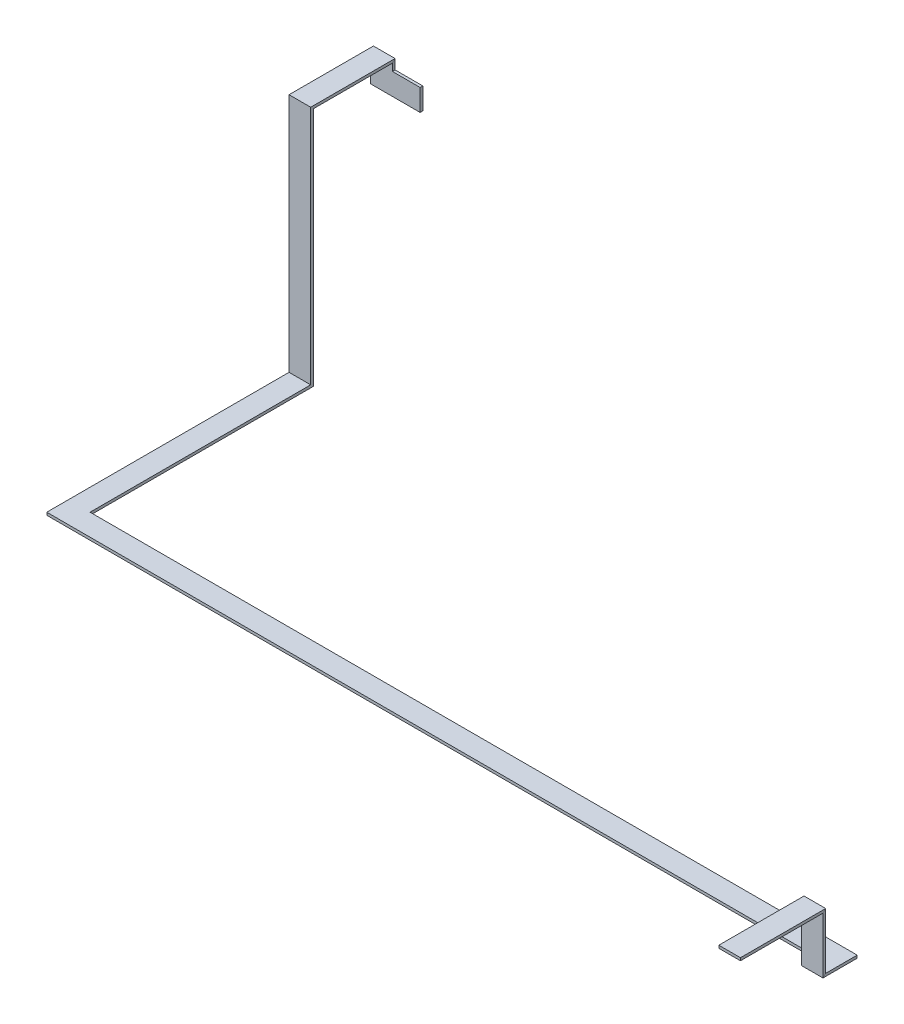
ISO-10303-21;
HEADER;
FILE_DESCRIPTION(('STEP AP214'),'2;1');
FILE_NAME('part.step','',(''),(''),'','','');
FILE_SCHEMA(('AUTOMOTIVE_DESIGN { 1 0 10303 214 1 1 1 1 }'));
ENDSEC;
DATA;
#1=APPLICATION_CONTEXT('core data for automotive mechanical design processes');
#2=APPLICATION_PROTOCOL_DEFINITION('international standard','automotive_design',2000,#1);
#3=PRODUCT_CONTEXT('',#1,'mechanical');
#4=PRODUCT('Part','Part','',(#3));
#5=PRODUCT_RELATED_PRODUCT_CATEGORY('part','',(#4));
#6=PRODUCT_DEFINITION_FORMATION('','',#4);
#7=PRODUCT_DEFINITION_CONTEXT('part definition',#1,'design');
#8=PRODUCT_DEFINITION('design','',#6,#7);
#9=PRODUCT_DEFINITION_SHAPE('','',#8);
#10=(LENGTH_UNIT() NAMED_UNIT(*) SI_UNIT(.MILLI.,.METRE.));
#11=(NAMED_UNIT(*) PLANE_ANGLE_UNIT() SI_UNIT($,.RADIAN.));
#12=(NAMED_UNIT(*) SI_UNIT($,.STERADIAN.) SOLID_ANGLE_UNIT());
#13=UNCERTAINTY_MEASURE_WITH_UNIT(LENGTH_MEASURE(1.E-05),#10,'distance_accuracy_value','');
#14=(GEOMETRIC_REPRESENTATION_CONTEXT(3) GLOBAL_UNCERTAINTY_ASSIGNED_CONTEXT((#13)) GLOBAL_UNIT_ASSIGNED_CONTEXT((#10,
#11,#12)) REPRESENTATION_CONTEXT('',''));
#15=CARTESIAN_POINT('',(0.,0.,0.));
#16=DIRECTION('',(0.,0.,1.));
#17=DIRECTION('',(1.,0.,0.));
#18=AXIS2_PLACEMENT_3D('',#15,#16,#17);
#19=CARTESIAN_POINT('',(25.4,285.6105,-185.365));
#20=DIRECTION('',(1.,0.,0.));
#21=DIRECTION('',(0.,0.,-1.));
#22=AXIS2_PLACEMENT_3D('',#19,#20,#21);
#23=PLANE('',#22);
#24=DIRECTION('',(0.,-1.,0.));
#25=VECTOR('',#24,1.);
#26=CARTESIAN_POINT('',(25.4,285.6105,-185.365));
#27=LINE('',#26,#25);
#28=CARTESIAN_POINT('',(25.4,278.885,-185.365));
#29=VERTEX_POINT('',#28);
#30=CARTESIAN_POINT('',(25.4,262.04,-185.365));
#31=VERTEX_POINT('',#30);
#32=EDGE_CURVE('E55',#29,#31,#27,.T.);
#33=ORIENTED_EDGE('',*,*,#32,.T.);
#34=DIRECTION('',(0.,0.,1.));
#35=VECTOR('',#34,1.);
#36=CARTESIAN_POINT('',(25.4,262.04,-185.365));
#37=LINE('',#36,#35);
#38=CARTESIAN_POINT('',(25.4,262.04,-191.675));
#39=VERTEX_POINT('',#38);
#40=EDGE_CURVE('E50',#39,#31,#37,.T.);
#41=ORIENTED_EDGE('',*,*,#40,.F.);
#42=DIRECTION('',(0.,-1.,0.));
#43=VECTOR('',#42,1.);
#44=CARTESIAN_POINT('',(25.4,285.6105,-191.675));
#45=LINE('',#44,#43);
#46=CARTESIAN_POINT('',(25.4,285.195,-191.675));
#47=VERTEX_POINT('',#46);
#48=EDGE_CURVE('E193',#47,#39,#45,.T.);
#49=ORIENTED_EDGE('',*,*,#48,.F.);
#50=DIRECTION('',(0.,0.707106781186548,-0.707106781186548));
#51=VECTOR('',#50,1.);
#52=CARTESIAN_POINT('',(25.4,186.2025,-92.6825));
#53=LINE('',#52,#51);
#54=EDGE_CURVE('E268',#29,#47,#53,.T.);
#55=ORIENTED_EDGE('',*,*,#54,.F.);
#56=EDGE_LOOP('',(#33,#41,#49,#55));
#57=FACE_BOUND('',#56,.T.);
#58=ADVANCED_FACE('F35',(#57),#23,.T.);
#59=CARTESIAN_POINT('',(0.,0.,0.));
#60=DIRECTION('',(0.,0.,1.));
#61=DIRECTION('',(1.,0.,0.));
#62=AXIS2_PLACEMENT_3D('',#59,#60,#61);
#63=PLANE('',#62);
#64=DIRECTION('',(-1.,0.,0.));
#65=VECTOR('',#64,1.);
#66=CARTESIAN_POINT('',(25.4,278.885,0.));
#67=LINE('',#66,#65);
#68=CARTESIAN_POINT('',(25.4,278.885,0.));
#69=VERTEX_POINT('',#68);
#70=CARTESIAN_POINT('',(-25.4,278.885,0.));
#71=VERTEX_POINT('',#70);
#72=EDGE_CURVE('E279',#69,#71,#67,.T.);
#73=ORIENTED_EDGE('',*,*,#72,.F.);
#74=DIRECTION('',(0.,1.,0.));
#75=VECTOR('',#74,1.);
#76=CARTESIAN_POINT('',(25.4,285.195,0.));
#77=LINE('',#76,#75);
#78=CARTESIAN_POINT('',(25.4,-285.195,0.));
#79=VERTEX_POINT('',#78);
#80=EDGE_CURVE('E328',#79,#69,#77,.T.);
#81=ORIENTED_EDGE('',*,*,#80,.F.);
#82=DIRECTION('',(1.,0.,0.));
#83=VECTOR('',#82,1.);
#84=CARTESIAN_POINT('',(-25.4,-285.195,0.));
#85=LINE('',#84,#83);
#86=CARTESIAN_POINT('',(-25.4,-285.195,0.));
#87=VERTEX_POINT('',#86);
#88=EDGE_CURVE('E332',#87,#79,#85,.T.);
#89=ORIENTED_EDGE('',*,*,#88,.F.);
#90=DIRECTION('',(0.,-1.,0.));
#91=VECTOR('',#90,1.);
#92=CARTESIAN_POINT('',(-25.4,285.195,0.));
#93=LINE('',#92,#91);
#94=EDGE_CURVE('E339',#71,#87,#93,.T.);
#95=ORIENTED_EDGE('',*,*,#94,.F.);
#96=EDGE_LOOP('',(#73,#81,#89,#95));
#97=FACE_BOUND('',#96,.T.);
#98=ADVANCED_FACE('F377',(#97),#63,.F.);
#99=CARTESIAN_POINT('',(25.4,285.195,6.31));
#100=DIRECTION('',(-1.,0.,0.));
#101=DIRECTION('',(0.,-1.,0.));
#102=AXIS2_PLACEMENT_3D('',#99,#100,#101);
#103=PLANE('',#102);
#104=DIRECTION('',(0.,1.,0.));
#105=VECTOR('',#104,1.);
#106=CARTESIAN_POINT('',(25.4,-285.195,523.95));
#107=LINE('',#106,#105);
#108=CARTESIAN_POINT('',(25.4,-285.195,523.95));
#109=VERTEX_POINT('',#108);
#110=CARTESIAN_POINT('',(25.4,-278.885,523.95));
#111=VERTEX_POINT('',#110);
#112=EDGE_CURVE('E267',#109,#111,#107,.T.);
#113=ORIENTED_EDGE('',*,*,#112,.F.);
#114=DIRECTION('',(0.,0.,-1.));
#115=VECTOR('',#114,1.);
#116=CARTESIAN_POINT('',(25.4,-285.195,6.31));
#117=LINE('',#116,#115);
#118=EDGE_CURVE('E336',#109,#79,#117,.T.);
#119=ORIENTED_EDGE('',*,*,#118,.T.);
#120=ORIENTED_EDGE('',*,*,#80,.T.);
#121=DIRECTION('',(0.,0.,-1.));
#122=VECTOR('',#121,1.);
#123=CARTESIAN_POINT('',(25.4,278.885,0.));
#124=LINE('',#123,#122);
#125=EDGE_CURVE('E278',#69,#29,#124,.T.);
#126=ORIENTED_EDGE('',*,*,#125,.T.);
#127=ORIENTED_EDGE('',*,*,#54,.T.);
#128=DIRECTION('',(0.,0.,-1.));
#129=VECTOR('',#128,1.);
#130=CARTESIAN_POINT('',(25.4,285.195,6.31));
#131=LINE('',#130,#129);
#132=CARTESIAN_POINT('',(25.4,285.195,6.31));
#133=VERTEX_POINT('',#132);
#134=EDGE_CURVE('E11',#133,#47,#131,.T.);
#135=ORIENTED_EDGE('',*,*,#134,.F.);
#136=DIRECTION('',(0.,1.,0.));
#137=VECTOR('',#136,1.);
#138=CARTESIAN_POINT('',(25.4,285.195,6.31));
#139=LINE('',#138,#137);
#140=CARTESIAN_POINT('',(25.4,-278.885,6.31));
#141=VERTEX_POINT('',#140);
#142=EDGE_CURVE('E329',#141,#133,#139,.T.);
#143=ORIENTED_EDGE('',*,*,#142,.F.);
#144=DIRECTION('',(0.,0.,-1.));
#145=VECTOR('',#144,1.);
#146=CARTESIAN_POINT('',(25.4,-278.885,574.75));
#147=LINE('',#146,#145);
#148=EDGE_CURVE('E326',#111,#141,#147,.T.);
#149=ORIENTED_EDGE('',*,*,#148,.F.);
#150=EDGE_LOOP('',(#113,#119,#120,#126,#127,#135,#143,#149));
#151=FACE_BOUND('',#150,.T.);
#152=ADVANCED_FACE('F37',(#151),#103,.F.);
#153=CARTESIAN_POINT('',(-25.4,285.195,6.31));
#154=DIRECTION('',(0.,-1.,0.));
#155=DIRECTION('',(0.,0.,-1.));
#156=AXIS2_PLACEMENT_3D('',#153,#154,#155);
#157=PLANE('',#156);
#158=ORIENTED_EDGE('',*,*,#134,.T.);
#159=DIRECTION('',(-1.,0.,0.));
#160=VECTOR('',#159,1.);
#161=CARTESIAN_POINT('',(25.4,285.195,-191.675));
#162=LINE('',#161,#160);
#163=CARTESIAN_POINT('',(-25.4,285.195,-191.675));
#164=VERTEX_POINT('',#163);
#165=EDGE_CURVE('E264',#47,#164,#162,.T.);
#166=ORIENTED_EDGE('',*,*,#165,.T.);
#167=DIRECTION('',(0.,0.,-1.));
#168=VECTOR('',#167,1.);
#169=CARTESIAN_POINT('',(-25.4,285.195,6.31));
#170=LINE('',#169,#168);
#171=CARTESIAN_POINT('',(-25.4,285.195,6.31));
#172=VERTEX_POINT('',#171);
#173=EDGE_CURVE('E43',#172,#164,#170,.T.);
#174=ORIENTED_EDGE('',*,*,#173,.F.);
#175=DIRECTION('',(-1.,0.,0.));
#176=VECTOR('',#175,1.);
#177=CARTESIAN_POINT('',(-25.4,285.195,6.31));
#178=LINE('',#177,#176);
#179=EDGE_CURVE('E331',#133,#172,#178,.T.);
#180=ORIENTED_EDGE('',*,*,#179,.F.);
#181=EDGE_LOOP('',(#158,#166,#174,#180));
#182=FACE_BOUND('',#181,.T.);
#183=ADVANCED_FACE('F359',(#182),#157,.F.);
#184=CARTESIAN_POINT('',(-25.4,285.195,6.31));
#185=DIRECTION('',(1.,0.,0.));
#186=DIRECTION('',(0.,1.,0.));
#187=AXIS2_PLACEMENT_3D('',#184,#185,#186);
#188=PLANE('',#187);
#189=ORIENTED_EDGE('',*,*,#173,.T.);
#190=DIRECTION('',(0.,-0.707106781186548,0.707106781186548));
#191=VECTOR('',#190,1.);
#192=CARTESIAN_POINT('',(-25.4,186.2025,-92.6825));
#193=LINE('',#192,#191);
#194=CARTESIAN_POINT('',(-25.4,278.885,-185.365));
#195=VERTEX_POINT('',#194);
#196=EDGE_CURVE('E274',#164,#195,#193,.T.);
#197=ORIENTED_EDGE('',*,*,#196,.T.);
#198=DIRECTION('',(0.,0.,-1.));
#199=VECTOR('',#198,1.);
#200=CARTESIAN_POINT('',(-25.4,278.885,0.));
#201=LINE('',#200,#199);
#202=EDGE_CURVE('E275',#71,#195,#201,.T.);
#203=ORIENTED_EDGE('',*,*,#202,.F.);
#204=ORIENTED_EDGE('',*,*,#94,.T.);
#205=DIRECTION('',(0.,0.,-1.));
#206=VECTOR('',#205,1.);
#207=CARTESIAN_POINT('',(-25.4,-285.195,6.31));
#208=LINE('',#207,#206);
#209=CARTESIAN_POINT('',(-25.4,-285.195,574.75));
#210=VERTEX_POINT('',#209);
#211=EDGE_CURVE('E344',#210,#87,#208,.T.);
#212=ORIENTED_EDGE('',*,*,#211,.F.);
#213=DIRECTION('',(0.,-1.,0.));
#214=VECTOR('',#213,1.);
#215=CARTESIAN_POINT('',(-25.4,-278.885,574.75));
#216=LINE('',#215,#214);
#217=CARTESIAN_POINT('',(-25.4,-278.885,574.75));
#218=VERTEX_POINT('',#217);
#219=EDGE_CURVE('E316',#218,#210,#216,.T.);
#220=ORIENTED_EDGE('',*,*,#219,.F.);
#221=DIRECTION('',(0.,0.,-1.));
#222=VECTOR('',#221,1.);
#223=CARTESIAN_POINT('',(-25.4,-278.885,574.75));
#224=LINE('',#223,#222);
#225=CARTESIAN_POINT('',(-25.4,-278.885,6.31));
#226=VERTEX_POINT('',#225);
#227=EDGE_CURVE('E321',#218,#226,#224,.T.);
#228=ORIENTED_EDGE('',*,*,#227,.T.);
#229=DIRECTION('',(0.,-1.,0.));
#230=VECTOR('',#229,1.);
#231=CARTESIAN_POINT('',(-25.4,285.195,6.31));
#232=LINE('',#231,#230);
#233=EDGE_CURVE('E334',#172,#226,#232,.T.);
#234=ORIENTED_EDGE('',*,*,#233,.F.);
#235=EDGE_LOOP('',(#189,#197,#203,#204,#212,#220,#228,#234));
#236=FACE_BOUND('',#235,.T.);
#237=ADVANCED_FACE('F350',(#236),#188,.F.);
#238=CARTESIAN_POINT('',(-25.4,-285.195,6.31));
#239=DIRECTION('',(0.,1.,0.));
#240=DIRECTION('',(0.,0.,1.));
#241=AXIS2_PLACEMENT_3D('',#238,#239,#240);
#242=PLANE('',#241);
#243=ORIENTED_EDGE('',*,*,#88,.T.);
#244=ORIENTED_EDGE('',*,*,#118,.F.);
#245=DIRECTION('',(-1.,0.,0.));
#246=VECTOR('',#245,1.);
#247=CARTESIAN_POINT('',(1825.4,-285.195,523.95));
#248=LINE('',#247,#246);
#249=CARTESIAN_POINT('',(1825.4,-285.195,523.95));
#250=VERTEX_POINT('',#249);
#251=EDGE_CURVE('E310',#250,#109,#248,.T.);
#252=ORIENTED_EDGE('',*,*,#251,.F.);
#253=DIRECTION('',(0.,0.,-1.));
#254=VECTOR('',#253,1.);
#255=CARTESIAN_POINT('',(1825.4,-285.195,523.95));
#256=LINE('',#255,#254);
#257=CARTESIAN_POINT('',(1825.4,-285.195,604.315));
#258=VERTEX_POINT('',#257);
#259=EDGE_CURVE('E299',#258,#250,#256,.T.);
#260=ORIENTED_EDGE('',*,*,#259,.F.);
#261=DIRECTION('',(-1.,0.,0.));
#262=VECTOR('',#261,1.);
#263=CARTESIAN_POINT('',(1774.6,-285.195,604.315));
#264=LINE('',#263,#262);
#265=CARTESIAN_POINT('',(1774.6,-285.195,604.315));
#266=VERTEX_POINT('',#265);
#267=EDGE_CURVE('E201',#258,#266,#264,.T.);
#268=ORIENTED_EDGE('',*,*,#267,.T.);
#269=DIRECTION('',(0.,0.,1.));
#270=VECTOR('',#269,1.);
#271=CARTESIAN_POINT('',(1774.6,-285.195,574.75));
#272=LINE('',#271,#270);
#273=CARTESIAN_POINT('',(1774.6,-285.195,574.75));
#274=VERTEX_POINT('',#273);
#275=EDGE_CURVE('E217',#274,#266,#272,.T.);
#276=ORIENTED_EDGE('',*,*,#275,.F.);
#277=DIRECTION('',(1.,0.,0.));
#278=VECTOR('',#277,1.);
#279=CARTESIAN_POINT('',(-25.4,-285.195,574.75));
#280=LINE('',#279,#278);
#281=EDGE_CURVE('E319',#210,#274,#280,.T.);
#282=ORIENTED_EDGE('',*,*,#281,.F.);
#283=ORIENTED_EDGE('',*,*,#211,.T.);
#284=EDGE_LOOP('',(#243,#244,#252,#260,#268,#276,#282,#283));
#285=FACE_BOUND('',#284,.T.);
#286=ADVANCED_FACE('F373',(#285),#242,.F.);
#287=CARTESIAN_POINT('',(0.,0.,6.31));
#288=DIRECTION('',(0.,0.,1.));
#289=DIRECTION('',(1.,0.,0.));
#290=AXIS2_PLACEMENT_3D('',#287,#288,#289);
#291=PLANE('',#290);
#292=DIRECTION('',(-1.,0.,0.));
#293=VECTOR('',#292,1.);
#294=CARTESIAN_POINT('',(-25.4,-278.885,6.31));
#295=LINE('',#294,#293);
#296=EDGE_CURVE('E313',#141,#226,#295,.T.);
#297=ORIENTED_EDGE('',*,*,#296,.F.);
#298=ORIENTED_EDGE('',*,*,#142,.T.);
#299=ORIENTED_EDGE('',*,*,#179,.T.);
#300=ORIENTED_EDGE('',*,*,#233,.T.);
#301=EDGE_LOOP('',(#297,#298,#299,#300));
#302=FACE_BOUND('',#301,.T.);
#303=ADVANCED_FACE('F425',(#302),#291,.T.);
#304=CARTESIAN_POINT('',(-25.4,-278.885,574.75));
#305=DIRECTION('',(0.,-1.,0.));
#306=DIRECTION('',(0.,0.,-1.));
#307=AXIS2_PLACEMENT_3D('',#304,#305,#306);
#308=PLANE('',#307);
#309=ORIENTED_EDGE('',*,*,#296,.T.);
#310=ORIENTED_EDGE('',*,*,#227,.F.);
#311=DIRECTION('',(-1.,0.,0.));
#312=VECTOR('',#311,1.);
#313=CARTESIAN_POINT('',(-25.4,-278.885,574.75));
#314=LINE('',#313,#312);
#315=CARTESIAN_POINT('',(1774.6,-278.885,574.75));
#316=VERTEX_POINT('',#315);
#317=EDGE_CURVE('E314',#316,#218,#314,.T.);
#318=ORIENTED_EDGE('',*,*,#317,.F.);
#319=DIRECTION('',(0.,0.,1.));
#320=VECTOR('',#319,1.);
#321=CARTESIAN_POINT('',(1774.6,-278.885,574.75));
#322=LINE('',#321,#320);
#323=CARTESIAN_POINT('',(1774.6,-278.885,598.005));
#324=VERTEX_POINT('',#323);
#325=EDGE_CURVE('E215',#316,#324,#322,.T.);
#326=ORIENTED_EDGE('',*,*,#325,.T.);
#327=DIRECTION('',(1.,0.,0.));
#328=VECTOR('',#327,1.);
#329=CARTESIAN_POINT('',(1774.6,-278.885,598.005));
#330=LINE('',#329,#328);
#331=CARTESIAN_POINT('',(1825.4,-278.885,598.005));
#332=VERTEX_POINT('',#331);
#333=EDGE_CURVE('E208',#324,#332,#330,.T.);
#334=ORIENTED_EDGE('',*,*,#333,.T.);
#335=DIRECTION('',(0.,0.,1.));
#336=VECTOR('',#335,1.);
#337=CARTESIAN_POINT('',(1825.4,-278.885,523.95));
#338=LINE('',#337,#336);
#339=CARTESIAN_POINT('',(1825.4,-278.885,523.95));
#340=VERTEX_POINT('',#339);
#341=EDGE_CURVE('E303',#340,#332,#338,.T.);
#342=ORIENTED_EDGE('',*,*,#341,.F.);
#343=DIRECTION('',(-1.,0.,0.));
#344=VECTOR('',#343,1.);
#345=CARTESIAN_POINT('',(1825.4,-278.885,523.95));
#346=LINE('',#345,#344);
#347=EDGE_CURVE('E305',#340,#111,#346,.T.);
#348=ORIENTED_EDGE('',*,*,#347,.T.);
#349=ORIENTED_EDGE('',*,*,#148,.T.);
#350=EDGE_LOOP('',(#309,#310,#318,#326,#334,#342,#348,#349));
#351=FACE_BOUND('',#350,.T.);
#352=ADVANCED_FACE('F414',(#351),#308,.F.);
#353=CARTESIAN_POINT('',(0.,0.,574.75));
#354=DIRECTION('',(0.,0.,1.));
#355=DIRECTION('',(1.,0.,0.));
#356=AXIS2_PLACEMENT_3D('',#353,#354,#355);
#357=PLANE('',#356);
#358=DIRECTION('',(0.,-1.,0.));
#359=VECTOR('',#358,1.);
#360=CARTESIAN_POINT('',(1774.6,-278.885,574.75));
#361=LINE('',#360,#359);
#362=EDGE_CURVE('E212',#316,#274,#361,.T.);
#363=ORIENTED_EDGE('',*,*,#362,.F.);
#364=ORIENTED_EDGE('',*,*,#317,.T.);
#365=ORIENTED_EDGE('',*,*,#219,.T.);
#366=ORIENTED_EDGE('',*,*,#281,.T.);
#367=EDGE_LOOP('',(#363,#364,#365,#366));
#368=FACE_BOUND('',#367,.T.);
#369=ADVANCED_FACE('F417',(#368),#357,.T.);
#370=CARTESIAN_POINT('',(1825.4,-285.195,523.95));
#371=DIRECTION('',(0.,0.,1.));
#372=DIRECTION('',(1.,0.,0.));
#373=AXIS2_PLACEMENT_3D('',#370,#371,#372);
#374=PLANE('',#373);
#375=ORIENTED_EDGE('',*,*,#112,.T.);
#376=ORIENTED_EDGE('',*,*,#347,.F.);
#377=DIRECTION('',(0.,1.,0.));
#378=VECTOR('',#377,1.);
#379=CARTESIAN_POINT('',(1825.4,-285.195,523.95));
#380=LINE('',#379,#378);
#381=EDGE_CURVE('E301',#250,#340,#380,.T.);
#382=ORIENTED_EDGE('',*,*,#381,.F.);
#383=ORIENTED_EDGE('',*,*,#251,.T.);
#384=EDGE_LOOP('',(#375,#376,#382,#383));
#385=FACE_BOUND('',#384,.T.);
#386=ADVANCED_FACE('F381',(#385),#374,.F.);
#387=CARTESIAN_POINT('',(1825.4,1.98704689066434E-13,0.));
#388=DIRECTION('',(1.,0.,0.));
#389=DIRECTION('',(0.,0.,-1.));
#390=AXIS2_PLACEMENT_3D('',#387,#388,#389);
#391=PLANE('',#390);
#392=ORIENTED_EDGE('',*,*,#341,.T.);
#393=DIRECTION('',(0.,-0.707106781186548,0.707106781186548));
#394=VECTOR('',#393,1.);
#395=CARTESIAN_POINT('',(1825.4,-267.2575,586.3775));
#396=LINE('',#395,#394);
#397=EDGE_CURVE('E205',#332,#258,#396,.T.);
#398=ORIENTED_EDGE('',*,*,#397,.T.);
#399=ORIENTED_EDGE('',*,*,#259,.T.);
#400=ORIENTED_EDGE('',*,*,#381,.T.);
#401=EDGE_LOOP('',(#392,#398,#399,#400));
#402=FACE_BOUND('',#401,.T.);
#403=ADVANCED_FACE('F385',(#402),#391,.T.);
#404=CARTESIAN_POINT('',(0.,211.24,93.5200000000001));
#405=DIRECTION('',(0.,1.,0.));
#406=DIRECTION('',(1.,0.,0.));
#407=AXIS2_PLACEMENT_3D('',#404,#405,#406);
#408=PLANE('',#407);
#409=DIRECTION('',(0.,0.,-1.));
#410=VECTOR('',#409,1.);
#411=CARTESIAN_POINT('',(-25.4,211.24,-185.365));
#412=LINE('',#411,#410);
#413=CARTESIAN_POINT('',(-25.4,211.24,-185.365));
#414=VERTEX_POINT('',#413);
#415=CARTESIAN_POINT('',(-25.4,211.24,-191.675));
#416=VERTEX_POINT('',#415);
#417=EDGE_CURVE('E290',#414,#416,#412,.T.);
#418=ORIENTED_EDGE('',*,*,#417,.T.);
#419=DIRECTION('',(1.,0.,0.));
#420=VECTOR('',#419,1.);
#421=CARTESIAN_POINT('',(25.4,211.24,-191.675));
#422=LINE('',#421,#420);
#423=CARTESIAN_POINT('',(90.4,211.24,-191.675));
#424=VERTEX_POINT('',#423);
#425=EDGE_CURVE('E288',#416,#424,#422,.T.);
#426=ORIENTED_EDGE('',*,*,#425,.T.);
#427=DIRECTION('',(0.,0.,-1.));
#428=VECTOR('',#427,1.);
#429=CARTESIAN_POINT('',(90.4,211.24,-191.675));
#430=LINE('',#429,#428);
#431=CARTESIAN_POINT('',(90.4,211.24,-185.365));
#432=VERTEX_POINT('',#431);
#433=EDGE_CURVE('E187',#432,#424,#430,.T.);
#434=ORIENTED_EDGE('',*,*,#433,.F.);
#435=DIRECTION('',(-1.,0.,0.));
#436=VECTOR('',#435,1.);
#437=CARTESIAN_POINT('',(25.4,211.24,-185.365));
#438=LINE('',#437,#436);
#439=EDGE_CURVE('E204',#432,#414,#438,.T.);
#440=ORIENTED_EDGE('',*,*,#439,.T.);
#441=EDGE_LOOP('',(#418,#426,#434,#440));
#442=FACE_BOUND('',#441,.T.);
#443=ADVANCED_FACE('F438',(#442),#408,.F.);
#444=CARTESIAN_POINT('',(-25.4,285.6105,-185.365));
#445=DIRECTION('',(-1.,0.,0.));
#446=DIRECTION('',(0.,0.,1.));
#447=AXIS2_PLACEMENT_3D('',#444,#445,#446);
#448=PLANE('',#447);
#449=ORIENTED_EDGE('',*,*,#196,.F.);
#450=DIRECTION('',(0.,-1.,0.));
#451=VECTOR('',#450,1.);
#452=CARTESIAN_POINT('',(-25.4,285.6105,-191.675));
#453=LINE('',#452,#451);
#454=EDGE_CURVE('E294',#164,#416,#453,.T.);
#455=ORIENTED_EDGE('',*,*,#454,.T.);
#456=ORIENTED_EDGE('',*,*,#417,.F.);
#457=DIRECTION('',(0.,-1.,0.));
#458=VECTOR('',#457,1.);
#459=CARTESIAN_POINT('',(-25.4,285.6105,-185.365));
#460=LINE('',#459,#458);
#461=EDGE_CURVE('E284',#195,#414,#460,.T.);
#462=ORIENTED_EDGE('',*,*,#461,.F.);
#463=EDGE_LOOP('',(#449,#455,#456,#462));
#464=FACE_BOUND('',#463,.T.);
#465=ADVANCED_FACE('F357',(#464),#448,.T.);
#466=CARTESIAN_POINT('',(25.4,285.6105,-191.675));
#467=DIRECTION('',(0.,0.,-1.));
#468=DIRECTION('',(-1.,0.,0.));
#469=AXIS2_PLACEMENT_3D('',#466,#467,#468);
#470=PLANE('',#469);
#471=ORIENTED_EDGE('',*,*,#165,.F.);
#472=ORIENTED_EDGE('',*,*,#48,.T.);
#473=DIRECTION('',(-1.,0.,0.));
#474=VECTOR('',#473,1.);
#475=CARTESIAN_POINT('',(90.4,262.04,-191.675));
#476=LINE('',#475,#474);
#477=CARTESIAN_POINT('',(90.4,262.04,-191.675));
#478=VERTEX_POINT('',#477);
#479=EDGE_CURVE('E174',#478,#39,#476,.T.);
#480=ORIENTED_EDGE('',*,*,#479,.F.);
#481=DIRECTION('',(0.,1.,0.));
#482=VECTOR('',#481,1.);
#483=CARTESIAN_POINT('',(90.4,262.04,-191.675));
#484=LINE('',#483,#482);
#485=EDGE_CURVE('E181',#424,#478,#484,.T.);
#486=ORIENTED_EDGE('',*,*,#485,.F.);
#487=ORIENTED_EDGE('',*,*,#425,.F.);
#488=ORIENTED_EDGE('',*,*,#454,.F.);
#489=EDGE_LOOP('',(#471,#472,#480,#486,#487,#488));
#490=FACE_BOUND('',#489,.T.);
#491=ADVANCED_FACE('F192',(#490),#470,.T.);
#492=CARTESIAN_POINT('',(25.4,285.6105,-185.365));
#493=DIRECTION('',(0.,0.,1.));
#494=DIRECTION('',(1.,0.,0.));
#495=AXIS2_PLACEMENT_3D('',#492,#493,#494);
#496=PLANE('',#495);
#497=DIRECTION('',(1.,0.,0.));
#498=VECTOR('',#497,1.);
#499=CARTESIAN_POINT('',(25.4,278.885,-185.365));
#500=LINE('',#499,#498);
#501=EDGE_CURVE('E271',#195,#29,#500,.T.);
#502=ORIENTED_EDGE('',*,*,#501,.F.);
#503=ORIENTED_EDGE('',*,*,#461,.T.);
#504=ORIENTED_EDGE('',*,*,#439,.F.);
#505=DIRECTION('',(0.,-1.,0.));
#506=VECTOR('',#505,1.);
#507=CARTESIAN_POINT('',(90.4,211.24,-185.365));
#508=LINE('',#507,#506);
#509=CARTESIAN_POINT('',(90.4,262.04,-185.365));
#510=VERTEX_POINT('',#509);
#511=EDGE_CURVE('E180',#510,#432,#508,.T.);
#512=ORIENTED_EDGE('',*,*,#511,.F.);
#513=DIRECTION('',(-1.,0.,0.));
#514=VECTOR('',#513,1.);
#515=CARTESIAN_POINT('',(90.4,262.04,-185.365));
#516=LINE('',#515,#514);
#517=EDGE_CURVE('E176',#510,#31,#516,.T.);
#518=ORIENTED_EDGE('',*,*,#517,.T.);
#519=ORIENTED_EDGE('',*,*,#32,.F.);
#520=EDGE_LOOP('',(#502,#503,#504,#512,#518,#519));
#521=FACE_BOUND('',#520,.T.);
#522=ADVANCED_FACE('F365',(#521),#496,.T.);
#523=CARTESIAN_POINT('',(25.4,278.885,0.));
#524=DIRECTION('',(0.,-1.,0.));
#525=DIRECTION('',(0.,0.,-1.));
#526=AXIS2_PLACEMENT_3D('',#523,#524,#525);
#527=PLANE('',#526);
#528=ORIENTED_EDGE('',*,*,#202,.T.);
#529=ORIENTED_EDGE('',*,*,#501,.T.);
#530=ORIENTED_EDGE('',*,*,#125,.F.);
#531=ORIENTED_EDGE('',*,*,#72,.T.);
#532=EDGE_LOOP('',(#528,#529,#530,#531));
#533=FACE_BOUND('',#532,.T.);
#534=ADVANCED_FACE('F367',(#533),#527,.T.);
#535=CARTESIAN_POINT('',(0.,131.76,797.94));
#536=DIRECTION('',(0.,0.,1.));
#537=DIRECTION('',(1.,0.,0.));
#538=AXIS2_PLACEMENT_3D('',#535,#536,#537);
#539=PLANE('',#538);
#540=DIRECTION('',(0.,1.,0.));
#541=VECTOR('',#540,1.);
#542=CARTESIAN_POINT('',(1825.4,-147.125,797.94));
#543=LINE('',#542,#541);
#544=CARTESIAN_POINT('',(1825.4,-153.435,797.94));
#545=VERTEX_POINT('',#544);
#546=CARTESIAN_POINT('',(1825.4,-147.125,797.94));
#547=VERTEX_POINT('',#546);
#548=EDGE_CURVE('E196',#545,#547,#543,.T.);
#549=ORIENTED_EDGE('',*,*,#548,.T.);
#550=DIRECTION('',(-1.,0.,0.));
#551=VECTOR('',#550,1.);
#552=CARTESIAN_POINT('',(1774.6,-147.125,797.94));
#553=LINE('',#552,#551);
#554=CARTESIAN_POINT('',(1774.6,-147.125,797.94));
#555=VERTEX_POINT('',#554);
#556=EDGE_CURVE('E194',#547,#555,#553,.T.);
#557=ORIENTED_EDGE('',*,*,#556,.T.);
#558=DIRECTION('',(0.,-1.,0.));
#559=VECTOR('',#558,1.);
#560=CARTESIAN_POINT('',(1774.6,-147.125,797.94));
#561=LINE('',#560,#559);
#562=CARTESIAN_POINT('',(1774.6,-153.435,797.94));
#563=VERTEX_POINT('',#562);
#564=EDGE_CURVE('E251',#555,#563,#561,.T.);
#565=ORIENTED_EDGE('',*,*,#564,.T.);
#566=DIRECTION('',(1.,0.,0.));
#567=VECTOR('',#566,1.);
#568=CARTESIAN_POINT('',(1774.6,-153.435,797.94));
#569=LINE('',#568,#567);
#570=EDGE_CURVE('E249',#563,#545,#569,.T.);
#571=ORIENTED_EDGE('',*,*,#570,.T.);
#572=EDGE_LOOP('',(#549,#557,#565,#571));
#573=FACE_BOUND('',#572,.T.);
#574=ADVANCED_FACE('F446',(#573),#539,.T.);
#575=CARTESIAN_POINT('',(1774.6,-147.125,597.5895));
#576=DIRECTION('',(-1.,0.,0.));
#577=DIRECTION('',(0.,0.,1.));
#578=AXIS2_PLACEMENT_3D('',#575,#576,#577);
#579=PLANE('',#578);
#580=DIRECTION('',(0.,0.707106781186548,-0.707106781186548));
#581=VECTOR('',#580,1.);
#582=CARTESIAN_POINT('',(1774.6,-216.36775,667.24775));
#583=LINE('',#582,#581);
#584=CARTESIAN_POINT('',(1774.6,-153.435,604.315));
#585=VERTEX_POINT('',#584);
#586=CARTESIAN_POINT('',(1774.6,-147.125,598.005));
#587=VERTEX_POINT('',#586);
#588=EDGE_CURVE('E232',#585,#587,#583,.T.);
#589=ORIENTED_EDGE('',*,*,#588,.F.);
#590=DIRECTION('',(0.,0.,1.));
#591=VECTOR('',#590,1.);
#592=CARTESIAN_POINT('',(1774.6,-153.435,597.5895));
#593=LINE('',#592,#591);
#594=EDGE_CURVE('E259',#585,#563,#593,.T.);
#595=ORIENTED_EDGE('',*,*,#594,.T.);
#596=ORIENTED_EDGE('',*,*,#564,.F.);
#597=DIRECTION('',(0.,0.,1.));
#598=VECTOR('',#597,1.);
#599=CARTESIAN_POINT('',(1774.6,-147.125,597.5895));
#600=LINE('',#599,#598);
#601=EDGE_CURVE('E237',#587,#555,#600,.T.);
#602=ORIENTED_EDGE('',*,*,#601,.F.);
#603=EDGE_LOOP('',(#589,#595,#596,#602));
#604=FACE_BOUND('',#603,.T.);
#605=ADVANCED_FACE('F451',(#604),#579,.T.);
#606=CARTESIAN_POINT('',(1774.6,-153.435,597.5895));
#607=DIRECTION('',(0.,-1.,0.));
#608=DIRECTION('',(0.,0.,-1.));
#609=AXIS2_PLACEMENT_3D('',#606,#607,#608);
#610=PLANE('',#609);
#611=DIRECTION('',(-1.,0.,0.));
#612=VECTOR('',#611,1.);
#613=CARTESIAN_POINT('',(1774.6,-153.435,604.315));
#614=LINE('',#613,#612);
#615=CARTESIAN_POINT('',(1825.4,-153.435,604.315));
#616=VERTEX_POINT('',#615);
#617=EDGE_CURVE('E216',#616,#585,#614,.T.);
#618=ORIENTED_EDGE('',*,*,#617,.F.);
#619=DIRECTION('',(0.,0.,1.));
#620=VECTOR('',#619,1.);
#621=CARTESIAN_POINT('',(1825.4,-153.435,597.5895));
#622=LINE('',#621,#620);
#623=EDGE_CURVE('E256',#616,#545,#622,.T.);
#624=ORIENTED_EDGE('',*,*,#623,.T.);
#625=ORIENTED_EDGE('',*,*,#570,.F.);
#626=ORIENTED_EDGE('',*,*,#594,.F.);
#627=EDGE_LOOP('',(#618,#624,#625,#626));
#628=FACE_BOUND('',#627,.T.);
#629=ADVANCED_FACE('F500',(#628),#610,.T.);
#630=CARTESIAN_POINT('',(1825.4,-147.125,597.5895));
#631=DIRECTION('',(1.,0.,0.));
#632=DIRECTION('',(0.,0.,-1.));
#633=AXIS2_PLACEMENT_3D('',#630,#631,#632);
#634=PLANE('',#633);
#635=DIRECTION('',(0.,-0.707106781186548,0.707106781186548));
#636=VECTOR('',#635,1.);
#637=CARTESIAN_POINT('',(1825.4,-216.36775,667.24775));
#638=LINE('',#637,#636);
#639=CARTESIAN_POINT('',(1825.4,-147.125,598.005));
#640=VERTEX_POINT('',#639);
#641=EDGE_CURVE('E226',#640,#616,#638,.T.);
#642=ORIENTED_EDGE('',*,*,#641,.F.);
#643=DIRECTION('',(0.,0.,1.));
#644=VECTOR('',#643,1.);
#645=CARTESIAN_POINT('',(1825.4,-147.125,597.5895));
#646=LINE('',#645,#644);
#647=EDGE_CURVE('E253',#640,#547,#646,.T.);
#648=ORIENTED_EDGE('',*,*,#647,.T.);
#649=ORIENTED_EDGE('',*,*,#548,.F.);
#650=ORIENTED_EDGE('',*,*,#623,.F.);
#651=EDGE_LOOP('',(#642,#648,#649,#650));
#652=FACE_BOUND('',#651,.T.);
#653=ADVANCED_FACE('F398',(#652),#634,.T.);
#654=CARTESIAN_POINT('',(1774.6,-147.125,597.5895));
#655=DIRECTION('',(0.,1.,0.));
#656=DIRECTION('',(0.,0.,1.));
#657=AXIS2_PLACEMENT_3D('',#654,#655,#656);
#658=PLANE('',#657);
#659=DIRECTION('',(1.,0.,0.));
#660=VECTOR('',#659,1.);
#661=CARTESIAN_POINT('',(1774.6,-147.125,598.005));
#662=LINE('',#661,#660);
#663=EDGE_CURVE('E229',#587,#640,#662,.T.);
#664=ORIENTED_EDGE('',*,*,#663,.F.);
#665=ORIENTED_EDGE('',*,*,#601,.T.);
#666=ORIENTED_EDGE('',*,*,#556,.F.);
#667=ORIENTED_EDGE('',*,*,#647,.F.);
#668=EDGE_LOOP('',(#664,#665,#666,#667));
#669=FACE_BOUND('',#668,.T.);
#670=ADVANCED_FACE('F402',(#669),#658,.T.);
#671=CARTESIAN_POINT('',(1774.6,-285.6105,598.005));
#672=DIRECTION('',(0.,0.,-1.));
#673=DIRECTION('',(-1.,0.,0.));
#674=AXIS2_PLACEMENT_3D('',#671,#672,#673);
#675=PLANE('',#674);
#676=DIRECTION('',(0.,1.,0.));
#677=VECTOR('',#676,1.);
#678=CARTESIAN_POINT('',(1774.6,-285.6105,598.005));
#679=LINE('',#678,#677);
#680=EDGE_CURVE('E243',#324,#587,#679,.T.);
#681=ORIENTED_EDGE('',*,*,#680,.T.);
#682=ORIENTED_EDGE('',*,*,#663,.T.);
#683=DIRECTION('',(0.,1.,0.));
#684=VECTOR('',#683,1.);
#685=CARTESIAN_POINT('',(1825.4,-285.6105,598.005));
#686=LINE('',#685,#684);
#687=EDGE_CURVE('E233',#332,#640,#686,.T.);
#688=ORIENTED_EDGE('',*,*,#687,.F.);
#689=ORIENTED_EDGE('',*,*,#333,.F.);
#690=EDGE_LOOP('',(#681,#682,#688,#689));
#691=FACE_BOUND('',#690,.T.);
#692=ADVANCED_FACE('F405',(#691),#675,.T.);
#693=CARTESIAN_POINT('',(1825.4,-285.6105,598.005));
#694=DIRECTION('',(1.,0.,0.));
#695=DIRECTION('',(0.,0.,-1.));
#696=AXIS2_PLACEMENT_3D('',#693,#694,#695);
#697=PLANE('',#696);
#698=ORIENTED_EDGE('',*,*,#687,.T.);
#699=ORIENTED_EDGE('',*,*,#641,.T.);
#700=DIRECTION('',(0.,1.,0.));
#701=VECTOR('',#700,1.);
#702=CARTESIAN_POINT('',(1825.4,-285.6105,604.315));
#703=LINE('',#702,#701);
#704=EDGE_CURVE('E236',#258,#616,#703,.T.);
#705=ORIENTED_EDGE('',*,*,#704,.F.);
#706=ORIENTED_EDGE('',*,*,#397,.F.);
#707=EDGE_LOOP('',(#698,#699,#705,#706));
#708=FACE_BOUND('',#707,.T.);
#709=ADVANCED_FACE('F393',(#708),#697,.T.);
#710=CARTESIAN_POINT('',(1774.6,-285.6105,604.315));
#711=DIRECTION('',(0.,0.,1.));
#712=DIRECTION('',(1.,0.,0.));
#713=AXIS2_PLACEMENT_3D('',#710,#711,#712);
#714=PLANE('',#713);
#715=ORIENTED_EDGE('',*,*,#704,.T.);
#716=ORIENTED_EDGE('',*,*,#617,.T.);
#717=DIRECTION('',(0.,1.,0.));
#718=VECTOR('',#717,1.);
#719=CARTESIAN_POINT('',(1774.6,-285.6105,604.315));
#720=LINE('',#719,#718);
#721=EDGE_CURVE('E240',#266,#585,#720,.T.);
#722=ORIENTED_EDGE('',*,*,#721,.F.);
#723=ORIENTED_EDGE('',*,*,#267,.F.);
#724=EDGE_LOOP('',(#715,#716,#722,#723));
#725=FACE_BOUND('',#724,.T.);
#726=ADVANCED_FACE('F391',(#725),#714,.T.);
#727=CARTESIAN_POINT('',(1774.6,-285.6105,598.005));
#728=DIRECTION('',(-1.,0.,0.));
#729=DIRECTION('',(0.,0.,1.));
#730=AXIS2_PLACEMENT_3D('',#727,#728,#729);
#731=PLANE('',#730);
#732=ORIENTED_EDGE('',*,*,#721,.T.);
#733=ORIENTED_EDGE('',*,*,#588,.T.);
#734=ORIENTED_EDGE('',*,*,#680,.F.);
#735=DIRECTION('',(0.,0.707106781186548,-0.707106781186548));
#736=VECTOR('',#735,1.);
#737=CARTESIAN_POINT('',(1774.6,-267.2575,586.3775));
#738=LINE('',#737,#736);
#739=EDGE_CURVE('E211',#266,#324,#738,.T.);
#740=ORIENTED_EDGE('',*,*,#739,.F.);
#741=EDGE_LOOP('',(#732,#733,#734,#740));
#742=FACE_BOUND('',#741,.T.);
#743=ADVANCED_FACE('F408',(#742),#731,.T.);
#744=CARTESIAN_POINT('',(1774.6,-278.885,574.75));
#745=DIRECTION('',(-1.,0.,0.));
#746=DIRECTION('',(0.,0.,1.));
#747=AXIS2_PLACEMENT_3D('',#744,#745,#746);
#748=PLANE('',#747);
#749=ORIENTED_EDGE('',*,*,#275,.T.);
#750=ORIENTED_EDGE('',*,*,#739,.T.);
#751=ORIENTED_EDGE('',*,*,#325,.F.);
#752=ORIENTED_EDGE('',*,*,#362,.T.);
#753=EDGE_LOOP('',(#749,#750,#751,#752));
#754=FACE_BOUND('',#753,.T.);
#755=ADVANCED_FACE('F411',(#754),#748,.T.);
#756=CARTESIAN_POINT('',(90.4,262.04,-185.365));
#757=DIRECTION('',(0.,-1.,0.));
#758=DIRECTION('',(0.,0.,-1.));
#759=AXIS2_PLACEMENT_3D('',#756,#757,#758);
#760=PLANE('',#759);
#761=ORIENTED_EDGE('',*,*,#40,.T.);
#762=ORIENTED_EDGE('',*,*,#517,.F.);
#763=DIRECTION('',(0.,0.,1.));
#764=VECTOR('',#763,1.);
#765=CARTESIAN_POINT('',(90.4,262.04,-185.365));
#766=LINE('',#765,#764);
#767=EDGE_CURVE('E170',#478,#510,#766,.T.);
#768=ORIENTED_EDGE('',*,*,#767,.F.);
#769=ORIENTED_EDGE('',*,*,#479,.T.);
#770=EDGE_LOOP('',(#761,#762,#768,#769));
#771=FACE_BOUND('',#770,.T.);
#772=ADVANCED_FACE('F172',(#771),#760,.F.);
#773=CARTESIAN_POINT('',(90.4,0.,0.));
#774=DIRECTION('',(-1.,0.,0.));
#775=DIRECTION('',(0.,0.,1.));
#776=AXIS2_PLACEMENT_3D('',#773,#774,#775);
#777=PLANE('',#776);
#778=ORIENTED_EDGE('',*,*,#485,.T.);
#779=ORIENTED_EDGE('',*,*,#767,.T.);
#780=ORIENTED_EDGE('',*,*,#511,.T.);
#781=ORIENTED_EDGE('',*,*,#433,.T.);
#782=EDGE_LOOP('',(#778,#779,#780,#781));
#783=FACE_BOUND('',#782,.T.);
#784=ADVANCED_FACE('F185',(#783),#777,.F.);
#785=CLOSED_SHELL('',(#58,#98,#152,#183,#237,#286,#303,#352,#369,#386,#403,#443,#465,#491,#522,
#534,#574,#605,#629,#653,#670,#692,#709,#726,#743,#755,#772,#784));
#786=MANIFOLD_SOLID_BREP('B2',#785);
#787=ADVANCED_BREP_SHAPE_REPRESENTATION('',(#18,#786),#14);
#788=SHAPE_DEFINITION_REPRESENTATION(#9,#787);
ENDSEC;
END-ISO-10303-21;
